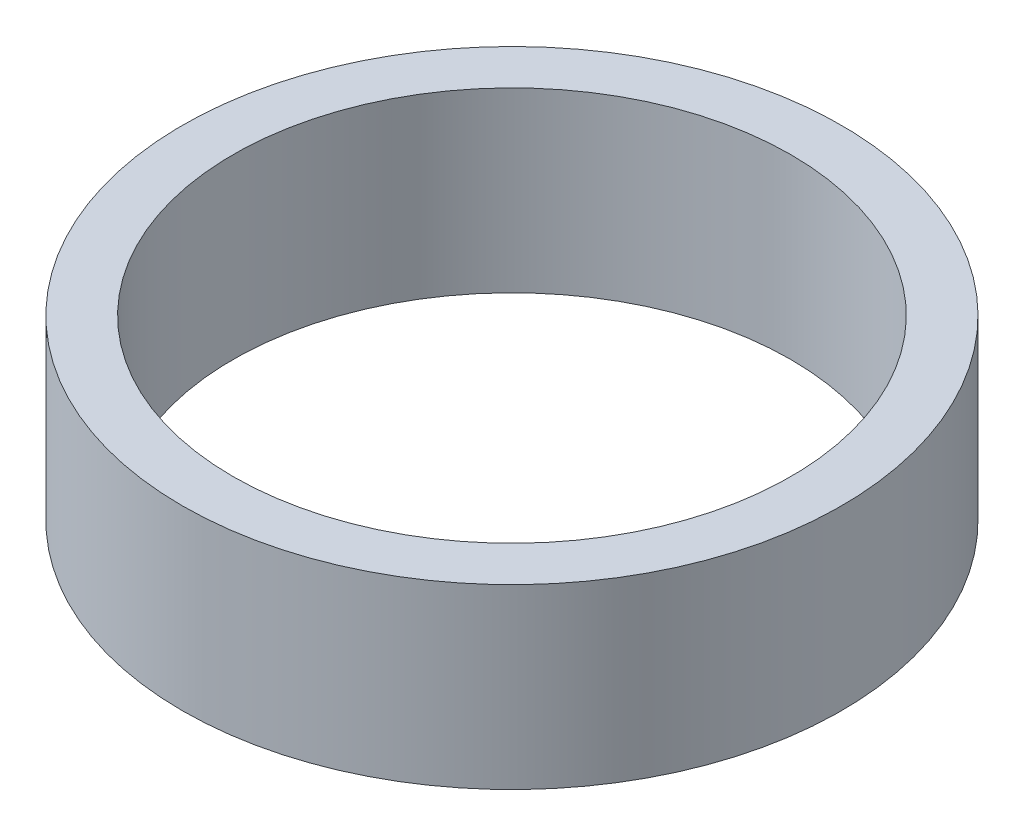
ISO-10303-21;
HEADER;
FILE_DESCRIPTION(('STEP AP214'),'2;1');
FILE_NAME('part.step','',(''),(''),'','','');
FILE_SCHEMA(('AUTOMOTIVE_DESIGN { 1 0 10303 214 1 1 1 1 }'));
ENDSEC;
DATA;
#1=APPLICATION_CONTEXT('core data for automotive mechanical design processes');
#2=APPLICATION_PROTOCOL_DEFINITION('international standard','automotive_design',2000,#1);
#3=PRODUCT_CONTEXT('',#1,'mechanical');
#4=PRODUCT('Part','Part','',(#3));
#5=PRODUCT_RELATED_PRODUCT_CATEGORY('part','',(#4));
#6=PRODUCT_DEFINITION_FORMATION('','',#4);
#7=PRODUCT_DEFINITION_CONTEXT('part definition',#1,'design');
#8=PRODUCT_DEFINITION('design','',#6,#7);
#9=PRODUCT_DEFINITION_SHAPE('','',#8);
#10=(LENGTH_UNIT() NAMED_UNIT(*) SI_UNIT(.MILLI.,.METRE.));
#11=(NAMED_UNIT(*) PLANE_ANGLE_UNIT() SI_UNIT($,.RADIAN.));
#12=(NAMED_UNIT(*) SI_UNIT($,.STERADIAN.) SOLID_ANGLE_UNIT());
#13=UNCERTAINTY_MEASURE_WITH_UNIT(LENGTH_MEASURE(1.E-05),#10,'distance_accuracy_value','');
#14=(GEOMETRIC_REPRESENTATION_CONTEXT(3) GLOBAL_UNCERTAINTY_ASSIGNED_CONTEXT((#13)) GLOBAL_UNIT_ASSIGNED_CONTEXT((#10,
#11,#12)) REPRESENTATION_CONTEXT('',''));
#15=CARTESIAN_POINT('',(0.,0.,0.));
#16=DIRECTION('',(0.,0.,1.));
#17=DIRECTION('',(1.,0.,0.));
#18=AXIS2_PLACEMENT_3D('',#15,#16,#17);
#19=CARTESIAN_POINT('',(0.,7.,0.));
#20=DIRECTION('',(0.,1.,0.));
#21=DIRECTION('',(0.,0.,1.));
#22=AXIS2_PLACEMENT_3D('',#19,#20,#21);
#23=PLANE('',#22);
#24=CARTESIAN_POINT('',(0.,7.,0.));
#25=DIRECTION('',(0.,1.,0.));
#26=DIRECTION('',(0.,0.,1.));
#27=AXIS2_PLACEMENT_3D('',#24,#25,#26);
#28=CIRCLE('',#27,13.);
#29=CARTESIAN_POINT('',(0.,7.,13.));
#30=VERTEX_POINT('',#29);
#31=EDGE_CURVE('E10',#30,#30,#28,.T.);
#32=ORIENTED_EDGE('',*,*,#31,.T.);
#33=EDGE_LOOP('',(#32));
#34=FACE_BOUND('',#33,.T.);
#35=CARTESIAN_POINT('',(0.,7.,0.));
#36=DIRECTION('',(0.,1.,0.));
#37=DIRECTION('',(0.,0.,1.));
#38=AXIS2_PLACEMENT_3D('',#35,#36,#37);
#39=CIRCLE('',#38,11.);
#40=CARTESIAN_POINT('',(0.,7.,11.));
#41=VERTEX_POINT('',#40);
#42=EDGE_CURVE('E42',#41,#41,#39,.T.);
#43=ORIENTED_EDGE('',*,*,#42,.F.);
#44=EDGE_LOOP('',(#43));
#45=FACE_BOUND('',#44,.T.);
#46=ADVANCED_FACE('F31',(#34,#45),#23,.T.);
#47=CARTESIAN_POINT('',(0.,0.,0.));
#48=DIRECTION('',(0.,1.,0.));
#49=DIRECTION('',(0.,0.,1.));
#50=AXIS2_PLACEMENT_3D('',#47,#48,#49);
#51=PLANE('',#50);
#52=CARTESIAN_POINT('',(0.,0.,0.));
#53=DIRECTION('',(0.,1.,0.));
#54=DIRECTION('',(0.,0.,1.));
#55=AXIS2_PLACEMENT_3D('',#52,#53,#54);
#56=CIRCLE('',#55,13.);
#57=CARTESIAN_POINT('',(0.,0.,13.));
#58=VERTEX_POINT('',#57);
#59=EDGE_CURVE('E35',#58,#58,#56,.T.);
#60=ORIENTED_EDGE('',*,*,#59,.F.);
#61=EDGE_LOOP('',(#60));
#62=FACE_BOUND('',#61,.T.);
#63=CARTESIAN_POINT('',(0.,0.,0.));
#64=DIRECTION('',(0.,1.,0.));
#65=DIRECTION('',(0.,0.,1.));
#66=AXIS2_PLACEMENT_3D('',#63,#64,#65);
#67=CIRCLE('',#66,11.);
#68=CARTESIAN_POINT('',(0.,0.,11.));
#69=VERTEX_POINT('',#68);
#70=EDGE_CURVE('E44',#69,#69,#67,.T.);
#71=ORIENTED_EDGE('',*,*,#70,.T.);
#72=EDGE_LOOP('',(#71));
#73=FACE_BOUND('',#72,.T.);
#74=ADVANCED_FACE('F54',(#62,#73),#51,.F.);
#75=CARTESIAN_POINT('',(0.,7.,0.));
#76=DIRECTION('',(0.,-1.,0.));
#77=DIRECTION('',(0.,0.,-1.));
#78=AXIS2_PLACEMENT_3D('',#75,#76,#77);
#79=CYLINDRICAL_SURFACE('',#78,13.);
#80=ORIENTED_EDGE('',*,*,#31,.F.);
#81=EDGE_LOOP('',(#80));
#82=FACE_BOUND('',#81,.T.);
#83=ORIENTED_EDGE('',*,*,#59,.T.);
#84=EDGE_LOOP('',(#83));
#85=FACE_BOUND('',#84,.T.);
#86=ADVANCED_FACE('F33',(#82,#85),#79,.T.);
#87=CARTESIAN_POINT('',(0.,7.,0.));
#88=DIRECTION('',(0.,-1.,0.));
#89=DIRECTION('',(0.,0.,-1.));
#90=AXIS2_PLACEMENT_3D('',#87,#88,#89);
#91=CYLINDRICAL_SURFACE('',#90,11.);
#92=ORIENTED_EDGE('',*,*,#42,.T.);
#93=EDGE_LOOP('',(#92));
#94=FACE_BOUND('',#93,.T.);
#95=ORIENTED_EDGE('',*,*,#70,.F.);
#96=EDGE_LOOP('',(#95));
#97=FACE_BOUND('',#96,.T.);
#98=ADVANCED_FACE('F50',(#94,#97),#91,.F.);
#99=CLOSED_SHELL('',(#46,#74,#86,#98));
#100=MANIFOLD_SOLID_BREP('B2',#99);
#101=ADVANCED_BREP_SHAPE_REPRESENTATION('',(#18,#100),#14);
#102=SHAPE_DEFINITION_REPRESENTATION(#9,#101);
ENDSEC;
END-ISO-10303-21;
